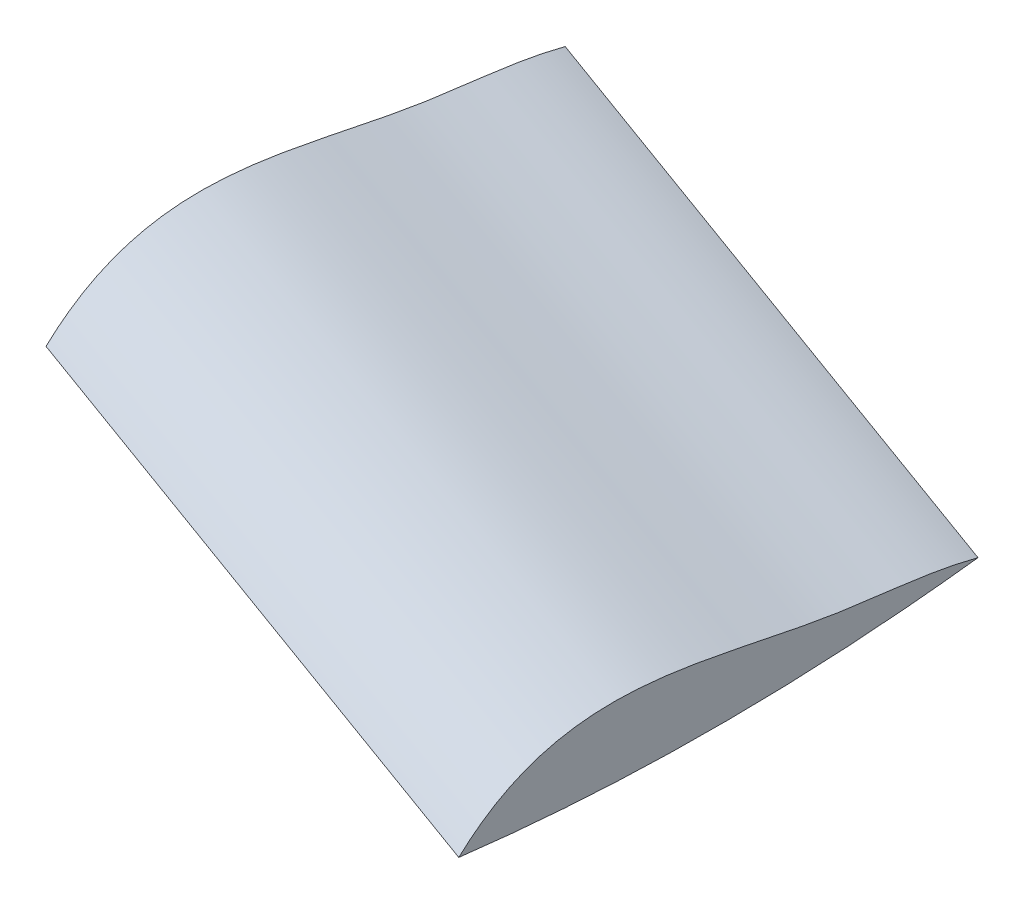
ISO-10303-21;
HEADER;
FILE_DESCRIPTION(('STEP AP214'),'2;1');
FILE_NAME('part.step','',(''),(''),'','','');
FILE_SCHEMA(('AUTOMOTIVE_DESIGN { 1 0 10303 214 1 1 1 1 }'));
ENDSEC;
DATA;
#1=APPLICATION_CONTEXT('core data for automotive mechanical design processes');
#2=APPLICATION_PROTOCOL_DEFINITION('international standard','automotive_design',2000,#1);
#3=PRODUCT_CONTEXT('',#1,'mechanical');
#4=PRODUCT('Part','Part','',(#3));
#5=PRODUCT_RELATED_PRODUCT_CATEGORY('part','',(#4));
#6=PRODUCT_DEFINITION_FORMATION('','',#4);
#7=PRODUCT_DEFINITION_CONTEXT('part definition',#1,'design');
#8=PRODUCT_DEFINITION('design','',#6,#7);
#9=PRODUCT_DEFINITION_SHAPE('','',#8);
#10=(LENGTH_UNIT() NAMED_UNIT(*) SI_UNIT(.MILLI.,.METRE.));
#11=(NAMED_UNIT(*) PLANE_ANGLE_UNIT() SI_UNIT($,.RADIAN.));
#12=(NAMED_UNIT(*) SI_UNIT($,.STERADIAN.) SOLID_ANGLE_UNIT());
#13=UNCERTAINTY_MEASURE_WITH_UNIT(LENGTH_MEASURE(1.E-05),#10,'distance_accuracy_value','');
#14=(GEOMETRIC_REPRESENTATION_CONTEXT(3) GLOBAL_UNCERTAINTY_ASSIGNED_CONTEXT((#13)) GLOBAL_UNIT_ASSIGNED_CONTEXT((#10,
#11,#12)) REPRESENTATION_CONTEXT('',''));
#15=CARTESIAN_POINT('',(0.,0.,0.));
#16=DIRECTION('',(0.,0.,1.));
#17=DIRECTION('',(1.,0.,0.));
#18=AXIS2_PLACEMENT_3D('',#15,#16,#17);
#19=CARTESIAN_POINT('',(0.,-19.000759592895,-209.861011224746));
#20=DIRECTION('',(-1.,0.,0.));
#21=DIRECTION('',(0.,0.,1.));
#22=AXIS2_PLACEMENT_3D('',#19,#20,#21);
#23=PLANE('',#22);
#24=CARTESIAN_POINT('',(0.,-3.6750964557679,43.7009764592046));
#25=CARTESIAN_POINT('',(0.,-34.326422730022,-209.422998908696));
#26=CARTESIAN_POINT('',(0.,-3.6750964557679,-464.299023540795));
#27=B_SPLINE_CURVE_WITH_KNOTS('',2,(#24,#25,#26),.UNSPECIFIED.,.F.,.F.,(3,3),(0.,1.),.UNSPECIFIED.);
#28=CARTESIAN_POINT('',(0.,-3.6750964557679,43.7009764592046));
#29=VERTEX_POINT('',#28);
#30=CARTESIAN_POINT('',(0.,-3.6750964557679,-464.299023540795));
#31=VERTEX_POINT('',#30);
#32=EDGE_CURVE('E61',#29,#31,#27,.T.);
#33=ORIENTED_EDGE('',*,*,#32,.T.);
#34=CARTESIAN_POINT('',(0.,-3.6750964557679,-464.299023540795));
#35=CARTESIAN_POINT('',(0.,8.74078390062267,-417.69942723074));
#36=CARTESIAN_POINT('',(0.,18.2596920768661,-246.664616315625));
#37=CARTESIAN_POINT('',(0.,93.5576710370726,-60.093960524119));
#38=CARTESIAN_POINT('',(0.,-3.6750964557679,43.7009764592046));
#39=B_SPLINE_CURVE_WITH_KNOTS('',3,(#34,#35,#36,#37,#38),.UNSPECIFIED.,.F.,.F.,(4,1,4),(0.,
0.273223185439462,1.),.UNSPECIFIED.);
#40=EDGE_CURVE('E66',#31,#29,#39,.T.);
#41=ORIENTED_EDGE('',*,*,#40,.T.);
#42=EDGE_LOOP('',(#33,#41));
#43=FACE_BOUND('',#42,.T.);
#44=ADVANCED_FACE('F33',(#43),#23,.F.);
#45=CARTESIAN_POINT('',(-635.,-19.000759592895,-440.982109983792));
#46=DIRECTION('',(-1.,0.,0.));
#47=DIRECTION('',(0.,0.,1.));
#48=AXIS2_PLACEMENT_3D('',#45,#46,#47);
#49=PLANE('',#48);
#50=CARTESIAN_POINT('',(-635.,-3.6750964557679,-187.420122299842));
#51=CARTESIAN_POINT('',(-635.,-34.326422730022,-440.544097667742));
#52=CARTESIAN_POINT('',(-635.,-3.6750964557679,-695.420122299842));
#53=B_SPLINE_CURVE_WITH_KNOTS('',2,(#50,#51,#52),.UNSPECIFIED.,.F.,.F.,(3,3),(0.,1.),.UNSPECIFIED.);
#54=CARTESIAN_POINT('',(-635.,-3.6750964557679,-187.420122299842));
#55=VERTEX_POINT('',#54);
#56=CARTESIAN_POINT('',(-635.,-3.6750964557679,-695.420122299842));
#57=VERTEX_POINT('',#56);
#58=EDGE_CURVE('E49',#55,#57,#53,.T.);
#59=ORIENTED_EDGE('',*,*,#58,.F.);
#60=CARTESIAN_POINT('',(-635.,-3.6750964557679,-695.420122299842));
#61=CARTESIAN_POINT('',(-635.,8.74078390062267,-648.820525989786));
#62=CARTESIAN_POINT('',(-635.,18.2596920768661,-477.785715074671));
#63=CARTESIAN_POINT('',(-635.,93.5576710370726,-291.215059283165));
#64=CARTESIAN_POINT('',(-635.,-3.6750964557679,-187.420122299842));
#65=B_SPLINE_CURVE_WITH_KNOTS('',3,(#60,#61,#62,#63,#64),.UNSPECIFIED.,.F.,.F.,(4,1,4),(0.,
0.273223185439462,1.),.UNSPECIFIED.);
#66=EDGE_CURVE('E11',#57,#55,#65,.T.);
#67=ORIENTED_EDGE('',*,*,#66,.F.);
#68=EDGE_LOOP('',(#59,#67));
#69=FACE_BOUND('',#68,.T.);
#70=ADVANCED_FACE('F92',(#69),#49,.T.);
#71=CARTESIAN_POINT('',(0.,-3.6750964557679,43.7009764592046));
#72=CARTESIAN_POINT('',(-635.,-3.6750964557679,-187.420122299842));
#73=CARTESIAN_POINT('',(0.,-34.326422730022,-209.422998908696));
#74=CARTESIAN_POINT('',(-635.,-34.326422730022,-440.544097667742));
#75=CARTESIAN_POINT('',(0.,-3.6750964557679,-464.299023540795));
#76=CARTESIAN_POINT('',(-635.,-3.6750964557679,-695.420122299842));
#77=B_SPLINE_SURFACE_WITH_KNOTS('',2,1,((#71,#72),(#73,#74),(#75,#76)),.UNSPECIFIED.,.F.,.F.,
.F.,(3,3),(2,2),(0.,1.),(0.,1.),.UNSPECIFIED.);
#78=DIRECTION('',(-0.939692620785905,0.,-0.342020143325679));
#79=VECTOR('',#78,1.);
#80=CARTESIAN_POINT('',(0.,-3.6750964557679,-464.299023540795));
#81=LINE('',#80,#79);
#82=EDGE_CURVE('E42',#31,#57,#81,.T.);
#83=DIRECTION('',(-0.939692620785905,0.,-0.342020143325679));
#84=VECTOR('',#83,1.);
#85=CARTESIAN_POINT('',(0.,-3.6750964557679,43.7009764592046));
#86=LINE('',#85,#84);
#87=EDGE_CURVE('E64',#29,#55,#86,.T.);
#88=ORIENTED_EDGE('',*,*,#82,.F.);
#89=ORIENTED_EDGE('',*,*,#32,.F.);
#90=ORIENTED_EDGE('',*,*,#87,.T.);
#91=ORIENTED_EDGE('',*,*,#58,.T.);
#92=EDGE_LOOP('',(#88,#89,#90,#91));
#93=FACE_BOUND('',#92,.T.);
#94=ADVANCED_FACE('F63',(#93),#77,.F.);
#95=CARTESIAN_POINT('',(0.,-3.6750964557679,-464.299023540795));
#96=CARTESIAN_POINT('',(-635.,-3.6750964557679,-695.420122299842));
#97=CARTESIAN_POINT('',(0.,8.74078390062267,-417.69942723074));
#98=CARTESIAN_POINT('',(-635.,8.74078390062267,-648.820525989786));
#99=CARTESIAN_POINT('',(0.,18.2596920768661,-246.664616315625));
#100=CARTESIAN_POINT('',(-635.,18.2596920768661,-477.785715074671));
#101=CARTESIAN_POINT('',(0.,93.5576710370726,-60.093960524119));
#102=CARTESIAN_POINT('',(-635.,93.5576710370726,-291.215059283165));
#103=CARTESIAN_POINT('',(0.,-3.6750964557679,43.7009764592046));
#104=CARTESIAN_POINT('',(-635.,-3.6750964557679,-187.420122299842));
#105=B_SPLINE_SURFACE_WITH_KNOTS('',3,1,((#95,#96),(#97,#98),(#99,#100),(#101,#102),(#103,
#104)),.UNSPECIFIED.,.F.,.F.,.F.,(4,1,4),(2,2),(0.,0.273223185439462,1.),(0.,1.),.UNSPECIFIED.);
#106=ORIENTED_EDGE('',*,*,#66,.T.);
#107=ORIENTED_EDGE('',*,*,#87,.F.);
#108=ORIENTED_EDGE('',*,*,#40,.F.);
#109=ORIENTED_EDGE('',*,*,#82,.T.);
#110=EDGE_LOOP('',(#106,#107,#108,#109));
#111=FACE_BOUND('',#110,.T.);
#112=ADVANCED_FACE('F68',(#111),#105,.F.);
#113=CLOSED_SHELL('',(#44,#70,#94,#112));
#114=MANIFOLD_SOLID_BREP('B2',#113);
#115=ADVANCED_BREP_SHAPE_REPRESENTATION('',(#18,#114),#14);
#116=SHAPE_DEFINITION_REPRESENTATION(#9,#115);
ENDSEC;
END-ISO-10303-21;
